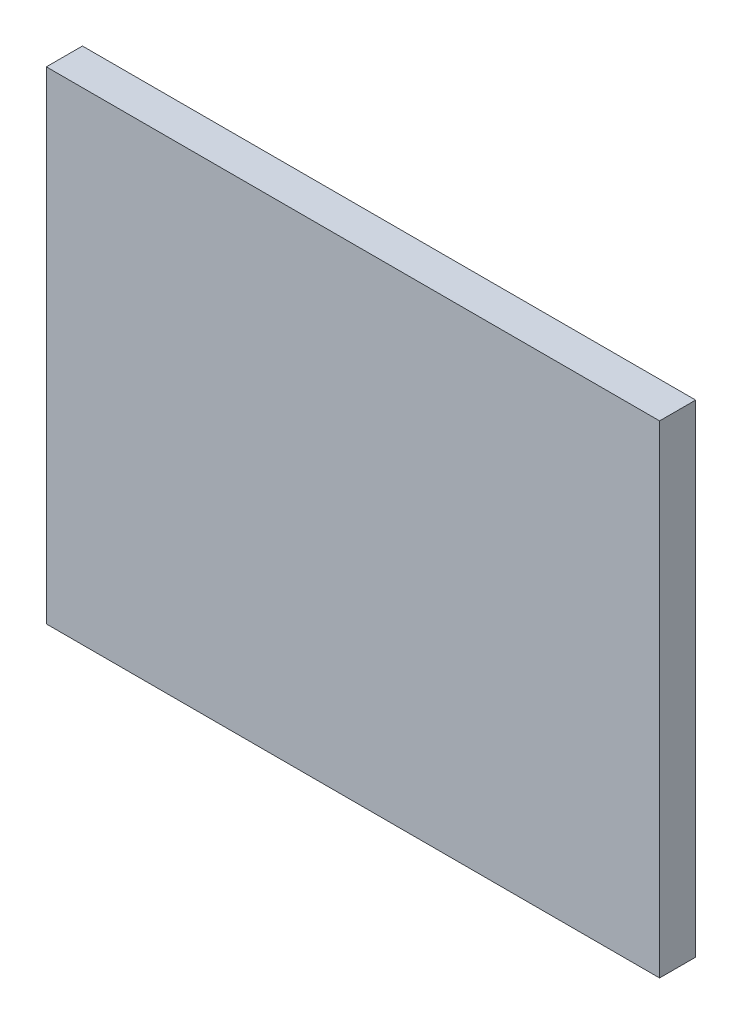
ISO-10303-21;
HEADER;
FILE_DESCRIPTION(('STEP AP214'),'2;1');
FILE_NAME('part.step','',(''),(''),'','','');
FILE_SCHEMA(('AUTOMOTIVE_DESIGN { 1 0 10303 214 1 1 1 1 }'));
ENDSEC;
DATA;
#1=APPLICATION_CONTEXT('core data for automotive mechanical design processes');
#2=APPLICATION_PROTOCOL_DEFINITION('international standard','automotive_design',2000,#1);
#3=PRODUCT_CONTEXT('',#1,'mechanical');
#4=PRODUCT('Part','Part','',(#3));
#5=PRODUCT_RELATED_PRODUCT_CATEGORY('part','',(#4));
#6=PRODUCT_DEFINITION_FORMATION('','',#4);
#7=PRODUCT_DEFINITION_CONTEXT('part definition',#1,'design');
#8=PRODUCT_DEFINITION('design','',#6,#7);
#9=PRODUCT_DEFINITION_SHAPE('','',#8);
#10=(LENGTH_UNIT() NAMED_UNIT(*) SI_UNIT(.MILLI.,.METRE.));
#11=(NAMED_UNIT(*) PLANE_ANGLE_UNIT() SI_UNIT($,.RADIAN.));
#12=(NAMED_UNIT(*) SI_UNIT($,.STERADIAN.) SOLID_ANGLE_UNIT());
#13=UNCERTAINTY_MEASURE_WITH_UNIT(LENGTH_MEASURE(1.E-05),#10,'distance_accuracy_value','');
#14=(GEOMETRIC_REPRESENTATION_CONTEXT(3) GLOBAL_UNCERTAINTY_ASSIGNED_CONTEXT((#13)) GLOBAL_UNIT_ASSIGNED_CONTEXT((#10,
#11,#12)) REPRESENTATION_CONTEXT('',''));
#15=CARTESIAN_POINT('',(0.,0.,0.));
#16=DIRECTION('',(0.,0.,1.));
#17=DIRECTION('',(1.,0.,0.));
#18=AXIS2_PLACEMENT_3D('',#15,#16,#17);
#19=CARTESIAN_POINT('',(107.95,-84.93125,12.7));
#20=DIRECTION('',(-1.,0.,0.));
#21=DIRECTION('',(0.,0.,1.));
#22=AXIS2_PLACEMENT_3D('',#19,#20,#21);
#23=PLANE('',#22);
#24=DIRECTION('',(0.,1.,0.));
#25=VECTOR('',#24,1.);
#26=CARTESIAN_POINT('',(107.95,-84.93125,0.));
#27=LINE('',#26,#25);
#28=CARTESIAN_POINT('',(107.95,-84.93125,0.));
#29=VERTEX_POINT('',#28);
#30=CARTESIAN_POINT('',(107.95,84.93125,0.));
#31=VERTEX_POINT('',#30);
#32=EDGE_CURVE('E94',#29,#31,#27,.T.);
#33=ORIENTED_EDGE('',*,*,#32,.T.);
#34=DIRECTION('',(0.,0.,-1.));
#35=VECTOR('',#34,1.);
#36=CARTESIAN_POINT('',(107.95,84.93125,12.7));
#37=LINE('',#36,#35);
#38=CARTESIAN_POINT('',(107.95,84.93125,12.7));
#39=VERTEX_POINT('',#38);
#40=EDGE_CURVE('E11',#39,#31,#37,.T.);
#41=ORIENTED_EDGE('',*,*,#40,.F.);
#42=DIRECTION('',(0.,1.,0.));
#43=VECTOR('',#42,1.);
#44=CARTESIAN_POINT('',(107.95,-84.93125,12.7));
#45=LINE('',#44,#43);
#46=CARTESIAN_POINT('',(107.95,-84.93125,12.7));
#47=VERTEX_POINT('',#46);
#48=EDGE_CURVE('E82',#47,#39,#45,.T.);
#49=ORIENTED_EDGE('',*,*,#48,.F.);
#50=DIRECTION('',(0.,0.,-1.));
#51=VECTOR('',#50,1.);
#52=CARTESIAN_POINT('',(107.95,-84.93125,12.7));
#53=LINE('',#52,#51);
#54=EDGE_CURVE('E90',#47,#29,#53,.T.);
#55=ORIENTED_EDGE('',*,*,#54,.T.);
#56=EDGE_LOOP('',(#33,#41,#49,#55));
#57=FACE_BOUND('',#56,.T.);
#58=ADVANCED_FACE('F31',(#57),#23,.F.);
#59=CARTESIAN_POINT('',(-107.95,84.93125,12.7));
#60=DIRECTION('',(0.,-1.,0.));
#61=DIRECTION('',(0.,0.,-1.));
#62=AXIS2_PLACEMENT_3D('',#59,#60,#61);
#63=PLANE('',#62);
#64=DIRECTION('',(-1.,0.,0.));
#65=VECTOR('',#64,1.);
#66=CARTESIAN_POINT('',(-107.95,84.93125,0.));
#67=LINE('',#66,#65);
#68=CARTESIAN_POINT('',(-107.95,84.93125,0.));
#69=VERTEX_POINT('',#68);
#70=EDGE_CURVE('E86',#31,#69,#67,.T.);
#71=ORIENTED_EDGE('',*,*,#70,.T.);
#72=DIRECTION('',(0.,0.,-1.));
#73=VECTOR('',#72,1.);
#74=CARTESIAN_POINT('',(-107.95,84.93125,12.7));
#75=LINE('',#74,#73);
#76=CARTESIAN_POINT('',(-107.95,84.93125,12.7));
#77=VERTEX_POINT('',#76);
#78=EDGE_CURVE('E39',#77,#69,#75,.T.);
#79=ORIENTED_EDGE('',*,*,#78,.F.);
#80=DIRECTION('',(-1.,0.,0.));
#81=VECTOR('',#80,1.);
#82=CARTESIAN_POINT('',(-107.95,84.93125,12.7));
#83=LINE('',#82,#81);
#84=EDGE_CURVE('E77',#39,#77,#83,.T.);
#85=ORIENTED_EDGE('',*,*,#84,.F.);
#86=ORIENTED_EDGE('',*,*,#40,.T.);
#87=EDGE_LOOP('',(#71,#79,#85,#86));
#88=FACE_BOUND('',#87,.T.);
#89=ADVANCED_FACE('F85',(#88),#63,.F.);
#90=CARTESIAN_POINT('',(-107.95,-84.93125,12.7));
#91=DIRECTION('',(1.,0.,0.));
#92=DIRECTION('',(0.,0.,-1.));
#93=AXIS2_PLACEMENT_3D('',#90,#91,#92);
#94=PLANE('',#93);
#95=DIRECTION('',(0.,-1.,0.));
#96=VECTOR('',#95,1.);
#97=CARTESIAN_POINT('',(-107.95,-84.93125,0.));
#98=LINE('',#97,#96);
#99=CARTESIAN_POINT('',(-107.95,-84.93125,0.));
#100=VERTEX_POINT('',#99);
#101=EDGE_CURVE('E64',#69,#100,#98,.T.);
#102=ORIENTED_EDGE('',*,*,#101,.T.);
#103=DIRECTION('',(0.,0.,-1.));
#104=VECTOR('',#103,1.);
#105=CARTESIAN_POINT('',(-107.95,-84.93125,12.7));
#106=LINE('',#105,#104);
#107=CARTESIAN_POINT('',(-107.95,-84.93125,12.7));
#108=VERTEX_POINT('',#107);
#109=EDGE_CURVE('E87',#108,#100,#106,.T.);
#110=ORIENTED_EDGE('',*,*,#109,.F.);
#111=DIRECTION('',(0.,-1.,0.));
#112=VECTOR('',#111,1.);
#113=CARTESIAN_POINT('',(-107.95,-84.93125,12.7));
#114=LINE('',#113,#112);
#115=EDGE_CURVE('E80',#77,#108,#114,.T.);
#116=ORIENTED_EDGE('',*,*,#115,.F.);
#117=ORIENTED_EDGE('',*,*,#78,.T.);
#118=EDGE_LOOP('',(#102,#110,#116,#117));
#119=FACE_BOUND('',#118,.T.);
#120=ADVANCED_FACE('F88',(#119),#94,.F.);
#121=CARTESIAN_POINT('',(-107.95,-84.93125,12.7));
#122=DIRECTION('',(0.,1.,0.));
#123=DIRECTION('',(0.,0.,1.));
#124=AXIS2_PLACEMENT_3D('',#121,#122,#123);
#125=PLANE('',#124);
#126=DIRECTION('',(1.,0.,0.));
#127=VECTOR('',#126,1.);
#128=CARTESIAN_POINT('',(-107.95,-84.93125,0.));
#129=LINE('',#128,#127);
#130=EDGE_CURVE('E70',#100,#29,#129,.T.);
#131=ORIENTED_EDGE('',*,*,#130,.T.);
#132=ORIENTED_EDGE('',*,*,#54,.F.);
#133=DIRECTION('',(1.,0.,0.));
#134=VECTOR('',#133,1.);
#135=CARTESIAN_POINT('',(-107.95,-84.93125,12.7));
#136=LINE('',#135,#134);
#137=EDGE_CURVE('E47',#108,#47,#136,.T.);
#138=ORIENTED_EDGE('',*,*,#137,.F.);
#139=ORIENTED_EDGE('',*,*,#109,.T.);
#140=EDGE_LOOP('',(#131,#132,#138,#139));
#141=FACE_BOUND('',#140,.T.);
#142=ADVANCED_FACE('F101',(#141),#125,.F.);
#143=CARTESIAN_POINT('',(107.95,84.93125,12.7));
#144=DIRECTION('',(0.,0.,-1.));
#145=DIRECTION('',(-1.,0.,0.));
#146=AXIS2_PLACEMENT_3D('',#143,#144,#145);
#147=PLANE('',#146);
#148=ORIENTED_EDGE('',*,*,#48,.T.);
#149=ORIENTED_EDGE('',*,*,#84,.T.);
#150=ORIENTED_EDGE('',*,*,#115,.T.);
#151=ORIENTED_EDGE('',*,*,#137,.T.);
#152=EDGE_LOOP('',(#148,#149,#150,#151));
#153=FACE_BOUND('',#152,.T.);
#154=ADVANCED_FACE('F78',(#153),#147,.F.);
#155=CARTESIAN_POINT('',(107.95,84.93125,0.));
#156=DIRECTION('',(0.,0.,-1.));
#157=DIRECTION('',(-1.,0.,0.));
#158=AXIS2_PLACEMENT_3D('',#155,#156,#157);
#159=PLANE('',#158);
#160=ORIENTED_EDGE('',*,*,#32,.F.);
#161=ORIENTED_EDGE('',*,*,#130,.F.);
#162=ORIENTED_EDGE('',*,*,#101,.F.);
#163=ORIENTED_EDGE('',*,*,#70,.F.);
#164=EDGE_LOOP('',(#160,#161,#162,#163));
#165=FACE_BOUND('',#164,.T.);
#166=ADVANCED_FACE('F104',(#165),#159,.T.);
#167=CLOSED_SHELL('',(#58,#89,#120,#142,#154,#166));
#168=MANIFOLD_SOLID_BREP('B2',#167);
#169=ADVANCED_BREP_SHAPE_REPRESENTATION('',(#18,#168),#14);
#170=SHAPE_DEFINITION_REPRESENTATION(#9,#169);
ENDSEC;
END-ISO-10303-21;
